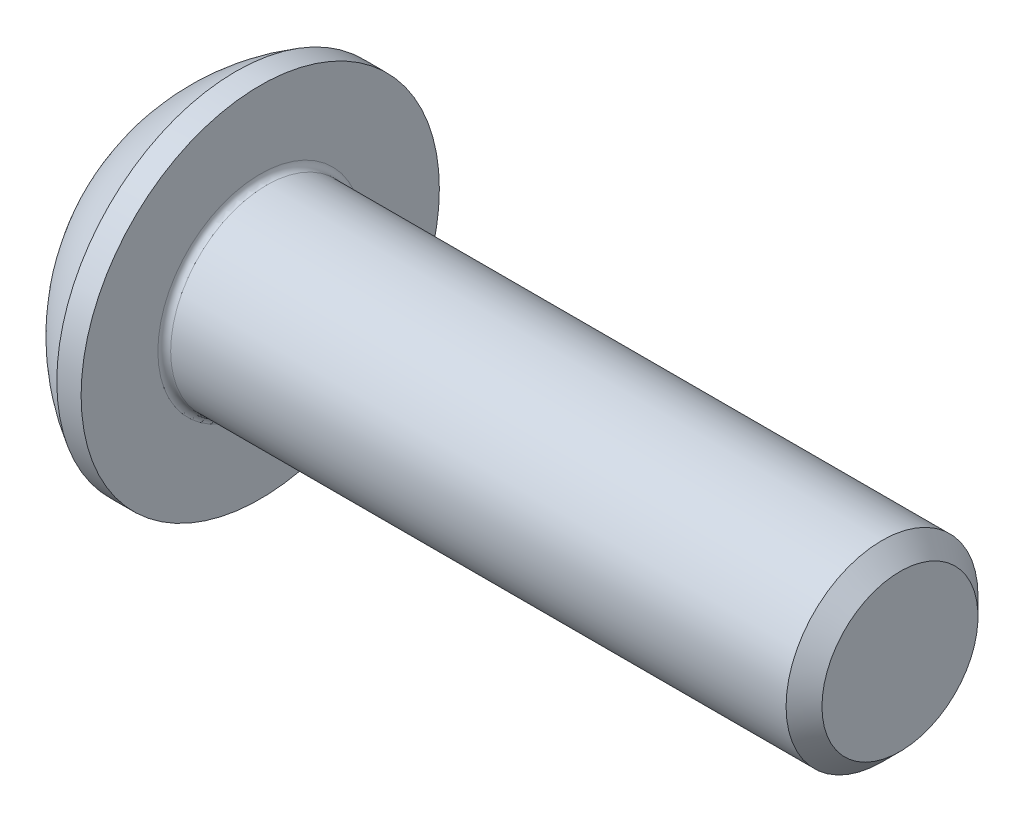
ISO-10303-21;
HEADER;
FILE_DESCRIPTION(('STEP AP214'),'2;1');
FILE_NAME('part.step','',(''),(''),'','','');
FILE_SCHEMA(('AUTOMOTIVE_DESIGN { 1 0 10303 214 1 1 1 1 }'));
ENDSEC;
DATA;
#1=APPLICATION_CONTEXT('core data for automotive mechanical design processes');
#2=APPLICATION_PROTOCOL_DEFINITION('international standard','automotive_design',2000,#1);
#3=PRODUCT_CONTEXT('',#1,'mechanical');
#4=PRODUCT('Part','Part','',(#3));
#5=PRODUCT_RELATED_PRODUCT_CATEGORY('part','',(#4));
#6=PRODUCT_DEFINITION_FORMATION('','',#4);
#7=PRODUCT_DEFINITION_CONTEXT('part definition',#1,'design');
#8=PRODUCT_DEFINITION('design','',#6,#7);
#9=PRODUCT_DEFINITION_SHAPE('','',#8);
#10=(LENGTH_UNIT() NAMED_UNIT(*) SI_UNIT(.MILLI.,.METRE.));
#11=(NAMED_UNIT(*) PLANE_ANGLE_UNIT() SI_UNIT($,.RADIAN.));
#12=(NAMED_UNIT(*) SI_UNIT($,.STERADIAN.) SOLID_ANGLE_UNIT());
#13=UNCERTAINTY_MEASURE_WITH_UNIT(LENGTH_MEASURE(1.E-05),#10,'distance_accuracy_value','');
#14=(GEOMETRIC_REPRESENTATION_CONTEXT(3) GLOBAL_UNCERTAINTY_ASSIGNED_CONTEXT((#13)) GLOBAL_UNIT_ASSIGNED_CONTEXT((#10,
#11,#12)) REPRESENTATION_CONTEXT('',''));
#15=CARTESIAN_POINT('',(0.,0.,0.));
#16=DIRECTION('',(0.,0.,1.));
#17=DIRECTION('',(1.,0.,0.));
#18=AXIS2_PLACEMENT_3D('',#15,#16,#17);
#19=CARTESIAN_POINT('',(0.,0.,0.));
#20=DIRECTION('',(-1.,0.,0.));
#21=DIRECTION('',(0.,0.,1.));
#22=AXIS2_PLACEMENT_3D('',#19,#20,#21);
#23=PLANE('',#22);
#24=CARTESIAN_POINT('',(0.,0.,0.));
#25=DIRECTION('',(-1.,0.,0.));
#26=DIRECTION('',(0.,0.,1.));
#27=AXIS2_PLACEMENT_3D('',#24,#25,#26);
#28=CIRCLE('',#27,1.4);
#29=CARTESIAN_POINT('',(0.,1.4,0.));
#30=VERTEX_POINT('',#29);
#31=EDGE_CURVE('E156',#30,#30,#28,.T.);
#32=ORIENTED_EDGE('',*,*,#31,.T.);
#33=EDGE_LOOP('',(#32));
#34=FACE_BOUND('',#33,.T.);
#35=DIRECTION('',(0.,-1.,0.));
#36=VECTOR('',#35,1.);
#37=CARTESIAN_POINT('',(0.,-0.577350269189625,0.999999999999998));
#38=LINE('',#37,#36);
#39=CARTESIAN_POINT('',(0.,0.577350269189628,1.));
#40=VERTEX_POINT('',#39);
#41=CARTESIAN_POINT('',(0.,-0.577350269189625,0.999999999999998));
#42=VERTEX_POINT('',#41);
#43=EDGE_CURVE('E51',#40,#42,#38,.T.);
#44=ORIENTED_EDGE('',*,*,#43,.T.);
#45=DIRECTION('',(0.,-0.499999999999999,-0.866025403784439));
#46=VECTOR('',#45,1.);
#47=CARTESIAN_POINT('',(0.,-1.15470053837925,0.));
#48=LINE('',#47,#46);
#49=CARTESIAN_POINT('',(0.,-1.15470053837925,0.));
#50=VERTEX_POINT('',#49);
#51=EDGE_CURVE('E276',#42,#50,#48,.T.);
#52=ORIENTED_EDGE('',*,*,#51,.T.);
#53=DIRECTION('',(0.,0.499999999999997,-0.86602540378444));
#54=VECTOR('',#53,1.);
#55=CARTESIAN_POINT('',(0.,-0.577350269189626,-1.));
#56=LINE('',#55,#54);
#57=CARTESIAN_POINT('',(0.,-0.577350269189626,-1.));
#58=VERTEX_POINT('',#57);
#59=EDGE_CURVE('E131',#50,#58,#56,.T.);
#60=ORIENTED_EDGE('',*,*,#59,.T.);
#61=DIRECTION('',(0.,1.,0.));
#62=VECTOR('',#61,1.);
#63=CARTESIAN_POINT('',(0.,0.577350269189628,-1.));
#64=LINE('',#63,#62);
#65=CARTESIAN_POINT('',(0.,0.577350269189628,-1.));
#66=VERTEX_POINT('',#65);
#67=EDGE_CURVE('E279',#58,#66,#64,.T.);
#68=ORIENTED_EDGE('',*,*,#67,.T.);
#69=DIRECTION('',(0.,0.499999999999998,0.866025403784439));
#70=VECTOR('',#69,1.);
#71=CARTESIAN_POINT('',(0.,1.15470053837925,0.));
#72=LINE('',#71,#70);
#73=CARTESIAN_POINT('',(0.,1.15470053837925,0.));
#74=VERTEX_POINT('',#73);
#75=EDGE_CURVE('E281',#66,#74,#72,.T.);
#76=ORIENTED_EDGE('',*,*,#75,.T.);
#77=DIRECTION('',(0.,-0.499999999999998,0.866025403784439));
#78=VECTOR('',#77,1.);
#79=CARTESIAN_POINT('',(0.,0.577350269189628,1.));
#80=LINE('',#79,#78);
#81=EDGE_CURVE('E283',#74,#40,#80,.T.);
#82=ORIENTED_EDGE('',*,*,#81,.T.);
#83=EDGE_LOOP('',(#44,#52,#60,#68,#76,#82));
#84=FACE_BOUND('',#83,.T.);
#85=ADVANCED_FACE('F36',(#34,#84),#23,.T.);
#86=CARTESIAN_POINT('',(2.88727272727273,0.,0.));
#87=DIRECTION('',(-1.,0.,0.));
#88=DIRECTION('',(0.,1.,0.));
#89=AXIS2_PLACEMENT_3D('',#86,#87,#88);
#90=SPHERICAL_SURFACE('',#89,3.2087916419819);
#91=CARTESIAN_POINT('',(1.32,0.,0.));
#92=DIRECTION('',(-1.,0.,0.));
#93=DIRECTION('',(0.,0.,1.));
#94=AXIS2_PLACEMENT_3D('',#91,#92,#93);
#95=CIRCLE('',#94,2.8);
#96=CARTESIAN_POINT('',(1.32,2.8,0.));
#97=VERTEX_POINT('',#96);
#98=EDGE_CURVE('E153',#97,#97,#95,.T.);
#99=CARTESIAN_POINT('',(1.32,2.8,0.));
#100=CARTESIAN_POINT('',(1.30223685243605,2.79005728003977,0.));
#101=CARTESIAN_POINT('',(1.28456834454886,2.77994548393524,0.));
#102=CARTESIAN_POINT('',(1.24942695184036,2.75938749748818,0.));
#103=CARTESIAN_POINT('',(1.23195406701906,2.74894130714565,0.));
#104=CARTESIAN_POINT('',(1.19721026415473,2.72771829027321,0.));
#105=CARTESIAN_POINT('',(1.1799393461117,2.71694146374331,0.));
#106=CARTESIAN_POINT('',(1.1456057283776,2.69506108475795,0.));
#107=CARTESIAN_POINT('',(1.12854302868653,2.68395753230251,0.));
#108=CARTESIAN_POINT('',(1.09463202889982,2.66142772137324,0.));
#109=CARTESIAN_POINT('',(1.07778372880418,2.65000146289942,0.));
#110=CARTESIAN_POINT('',(1.04430763043242,2.62683037905586,0.));
#111=CARTESIAN_POINT('',(1.0276798321563,2.61508555368612,0.));
#112=CARTESIAN_POINT('',(0.994650760146405,2.59128158993487,0.));
#113=CARTESIAN_POINT('',(0.978249486412629,2.57922245155336,0.));
#114=CARTESIAN_POINT('',(0.945679404064408,2.55479422967524,0.));
#115=CARTESIAN_POINT('',(0.929510595449963,2.54242514617864,0.));
#116=CARTESIAN_POINT('',(0.897411299743948,2.51738151418539,0.));
#117=CARTESIAN_POINT('',(0.881480812652378,2.50470696568875,0.));
#118=CARTESIAN_POINT('',(0.849863930067758,2.47905699446294,0.));
#119=CARTESIAN_POINT('',(0.834177534574709,2.46608157173378,0.));
#120=CARTESIAN_POINT('',(0.803054516853843,2.43983455178493,0.));
#121=CARTESIAN_POINT('',(0.787617894626026,2.42656295456524,0.));
#122=CARTESIAN_POINT('',(0.7570000146331,2.39972839265361,0.));
#123=CARTESIAN_POINT('',(0.741818756867991,2.38616542796167,0.));
#124=CARTESIAN_POINT('',(0.711717104504202,2.35875304365786,0.));
#125=CARTESIAN_POINT('',(0.696796709905523,2.344903624046,0.));
#126=CARTESIAN_POINT('',(0.667222188092748,2.31692334620972,0.));
#127=CARTESIAN_POINT('',(0.652568060878652,2.30279248798529,0.));
#128=CARTESIAN_POINT('',(0.623531381610245,2.27425445116925,0.));
#129=CARTESIAN_POINT('',(0.609148829555934,2.25984727257764,0.));
#130=CARTESIAN_POINT('',(0.580660510016839,2.23076181335678,0.));
#131=CARTESIAN_POINT('',(0.566554742532055,2.21608353272753,0.));
#132=CARTESIAN_POINT('',(0.538625101289437,2.18646118595506,0.));
#133=CARTESIAN_POINT('',(0.524801227531604,2.17151711981183,0.));
#134=CARTESIAN_POINT('',(0.497440380797433,2.14136861480347,0.));
#135=CARTESIAN_POINT('',(0.483903407821096,2.12616417593834,0.));
#136=CARTESIAN_POINT('',(0.457121265788016,2.09550043258613,0.));
#137=CARTESIAN_POINT('',(0.443876096731274,2.08004112809906,0.));
#138=CARTESIAN_POINT('',(0.417682359983098,2.04887325291616,0.));
#139=CARTESIAN_POINT('',(0.404733792291664,2.03316468222032,0.));
#140=CARTESIAN_POINT('',(0.3791379482898,2.00150396431813,0.));
#141=CARTESIAN_POINT('',(0.366490671979371,1.98555181711178,0.));
#142=CARTESIAN_POINT('',(0.341501991626376,1.95340972411107,0.));
#143=CARTESIAN_POINT('',(0.329160587583812,1.93721977831671,0.));
#144=CARTESIAN_POINT('',(0.30478812186566,1.90460795219388,0.));
#145=CARTESIAN_POINT('',(0.292757060190073,1.88818607186539,0.));
#146=CARTESIAN_POINT('',(0.269009636897027,1.8551163247361,0.));
#147=CARTESIAN_POINT('',(0.257293275279569,1.83846845793529,0.));
#148=CARTESIAN_POINT('',(0.234179495811814,1.80495276777454,0.));
#149=CARTESIAN_POINT('',(0.222782077961518,1.7880849444146,0.));
#150=CARTESIAN_POINT('',(0.200310314202188,1.7541354507241,0.));
#151=CARTESIAN_POINT('',(0.189235968293156,1.73705378039354,0.));
#152=CARTESIAN_POINT('',(0.16741435961898,1.7026827797829,0.));
#153=CARTESIAN_POINT('',(0.156667096853836,1.68539344950282,0.));
#154=CARTESIAN_POINT('',(0.13550354702667,1.65061339131721,0.));
#155=CARTESIAN_POINT('',(0.125087259964647,1.63312266341169,0.));
#156=CARTESIAN_POINT('',(0.104589434867148,1.59794614491831,0.));
#157=CARTESIAN_POINT('',(0.094507896831671,1.58026035433045,0.));
#158=CARTESIAN_POINT('',(0.0746832194572848,1.54470011729165,0.));
#159=CARTESIAN_POINT('',(0.0649400801183755,1.52682567084071,0.));
#160=CARTESIAN_POINT('',(0.0457957362178669,1.49089459265953,0.));
#161=CARTESIAN_POINT('',(0.0363945316562677,1.47283796092929,0.));
#162=CARTESIAN_POINT('',(0.0179374360277654,1.4365490658068,0.));
#163=CARTESIAN_POINT('',(0.00888154496086232,1.41831680241457,0.));
#164=CARTESIAN_POINT('',(0.,1.4,0.));
#165=B_SPLINE_CURVE_WITH_KNOTS('',3,(#99,#100,#101,#102,#103,#104,#105,#106,#107,#108,#109,#110,
#111,#112,#113,#114,#115,#116,#117,#118,#119,#120,#121,#122,#123,#124,#125,#126,#127,#128,#129,
#130,#131,#132,#133,#134,#135,#136,#137,#138,#139,#140,#141,#142,#143,#144,#145,#146,#147,#148,
#149,#150,#151,#152,#153,#154,#155,#156,#157,#158,#159,#160,#161,#162,#163,#164),.UNSPECIFIED.,
.F.,.F.,(4,2,2,2,2,2,2,2,2,2,2,2,2,2,2,2,2,2,2,2,2,2,2,2,2,2,2,2,2,2,2,2,4),(0.,
0.0610685768840659,0.122137153768132,0.183205730652197,0.244274307536263,0.305342884420328,
0.366411461304395,0.427480038188461,0.488548615072526,0.549617191956591,0.610685768840658,
0.671754345724723,0.732822922608789,0.793891499492855,0.854960076376921,0.916028653260986,
0.977097230145052,1.03816580702912,1.09923438391318,1.16030296079725,1.22137153768132,
1.28244011456538,1.34350869144945,1.40457726833351,1.46564584521758,1.52671442210164,
1.58778299898571,1.64885157586978,1.70992015275384,1.77098872963791,1.83205730652197,
1.89312588340604,1.9541944602901),.UNSPECIFIED.);
#166=EDGE_CURVE('BSEAM177',#97,#30,#165,.T.);
#167=ORIENTED_EDGE('',*,*,#98,.T.);
#168=ORIENTED_EDGE('',*,*,#31,.F.);
#169=ORIENTED_EDGE('',*,*,#166,.T.);
#170=ORIENTED_EDGE('',*,*,#166,.F.);
#171=EDGE_LOOP('',(#167,#169,#168,#170));
#172=FACE_BOUND('',#171,.T.);
#173=ADVANCED_FACE('F177',(#172),#90,.T.);
#174=CARTESIAN_POINT('',(0.,0.,0.));
#175=DIRECTION('',(-1.,0.,0.));
#176=DIRECTION('',(0.,0.,1.));
#177=AXIS2_PLACEMENT_3D('',#174,#175,#176);
#178=CYLINDRICAL_SURFACE('',#177,2.8);
#179=ORIENTED_EDGE('',*,*,#98,.F.);
#180=EDGE_LOOP('',(#179));
#181=FACE_BOUND('',#180,.T.);
#182=CARTESIAN_POINT('',(1.7,0.,0.));
#183=DIRECTION('',(-1.,0.,0.));
#184=DIRECTION('',(0.,0.,1.));
#185=AXIS2_PLACEMENT_3D('',#182,#183,#184);
#186=CIRCLE('',#185,2.8);
#187=CARTESIAN_POINT('',(1.7,0.,2.8));
#188=VERTEX_POINT('',#187);
#189=EDGE_CURVE('E150',#188,#188,#186,.T.);
#190=ORIENTED_EDGE('',*,*,#189,.T.);
#191=EDGE_LOOP('',(#190));
#192=FACE_BOUND('',#191,.T.);
#193=ADVANCED_FACE('F182',(#181,#192),#178,.T.);
#194=CARTESIAN_POINT('',(1.7,1.5,0.));
#195=DIRECTION('',(-1.,0.,0.));
#196=DIRECTION('',(0.,0.,1.));
#197=AXIS2_PLACEMENT_3D('',#194,#195,#196);
#198=PLANE('',#197);
#199=CARTESIAN_POINT('',(1.7,0.,0.));
#200=DIRECTION('',(-1.,0.,0.));
#201=DIRECTION('',(0.,0.,1.));
#202=AXIS2_PLACEMENT_3D('',#199,#200,#201);
#203=CIRCLE('',#202,1.6);
#204=CARTESIAN_POINT('',(1.7,0.,1.6));
#205=VERTEX_POINT('',#204);
#206=EDGE_CURVE('E44',#205,#205,#203,.T.);
#207=ORIENTED_EDGE('',*,*,#206,.T.);
#208=EDGE_LOOP('',(#207));
#209=FACE_BOUND('',#208,.T.);
#210=ORIENTED_EDGE('',*,*,#189,.F.);
#211=EDGE_LOOP('',(#210));
#212=FACE_BOUND('',#211,.T.);
#213=ADVANCED_FACE('F161',(#209,#212),#198,.F.);
#214=CARTESIAN_POINT('',(0.,0.,0.));
#215=DIRECTION('',(-1.,0.,0.));
#216=DIRECTION('',(0.,0.,1.));
#217=AXIS2_PLACEMENT_3D('',#214,#215,#216);
#218=CYLINDRICAL_SURFACE('',#217,1.5);
#219=CARTESIAN_POINT('',(1.8,0.,0.));
#220=DIRECTION('',(-1.,0.,0.));
#221=DIRECTION('',(0.,0.,1.));
#222=AXIS2_PLACEMENT_3D('',#219,#220,#221);
#223=CIRCLE('',#222,1.5);
#224=CARTESIAN_POINT('',(1.8,0.,1.5));
#225=VERTEX_POINT('',#224);
#226=EDGE_CURVE('E11',#225,#225,#223,.F.);
#227=ORIENTED_EDGE('',*,*,#226,.T.);
#228=EDGE_LOOP('',(#227));
#229=FACE_BOUND('',#228,.T.);
#230=CARTESIAN_POINT('',(11.4195,0.,0.));
#231=DIRECTION('',(-1.,0.,0.));
#232=DIRECTION('',(0.,0.,1.));
#233=AXIS2_PLACEMENT_3D('',#230,#231,#232);
#234=CIRCLE('',#233,1.5);
#235=CARTESIAN_POINT('',(11.4195,0.,1.5));
#236=VERTEX_POINT('',#235);
#237=EDGE_CURVE('E147',#236,#236,#234,.T.);
#238=ORIENTED_EDGE('',*,*,#237,.T.);
#239=EDGE_LOOP('',(#238));
#240=FACE_BOUND('',#239,.T.);
#241=ADVANCED_FACE('F191',(#229,#240),#218,.T.);
#242=CARTESIAN_POINT('',(11.7,0.,0.));
#243=DIRECTION('',(-1.,0.,0.));
#244=DIRECTION('',(0.,0.,1.));
#245=AXIS2_PLACEMENT_3D('',#242,#243,#244);
#246=CONICAL_SURFACE('',#245,1.2195,0.785398163397449);
#247=ORIENTED_EDGE('',*,*,#237,.F.);
#248=EDGE_LOOP('',(#247));
#249=FACE_BOUND('',#248,.T.);
#250=CARTESIAN_POINT('',(11.7,0.,0.));
#251=DIRECTION('',(-1.,0.,0.));
#252=DIRECTION('',(0.,0.,1.));
#253=AXIS2_PLACEMENT_3D('',#250,#251,#252);
#254=CIRCLE('',#253,1.2195);
#255=CARTESIAN_POINT('',(11.7,0.,1.2195));
#256=VERTEX_POINT('',#255);
#257=EDGE_CURVE('E143',#256,#256,#254,.T.);
#258=ORIENTED_EDGE('',*,*,#257,.T.);
#259=EDGE_LOOP('',(#258));
#260=FACE_BOUND('',#259,.T.);
#261=ADVANCED_FACE('F172',(#249,#260),#246,.T.);
#262=CARTESIAN_POINT('',(11.7,0.,0.));
#263=DIRECTION('',(-1.,0.,0.));
#264=DIRECTION('',(0.,0.,1.));
#265=AXIS2_PLACEMENT_3D('',#262,#263,#264);
#266=PLANE('',#265);
#267=ORIENTED_EDGE('',*,*,#257,.F.);
#268=EDGE_LOOP('',(#267));
#269=FACE_BOUND('',#268,.T.);
#270=ADVANCED_FACE('F165',(#269),#266,.F.);
#271=CARTESIAN_POINT('',(1.8,0.,0.));
#272=DIRECTION('',(-1.,0.,0.));
#273=DIRECTION('',(0.,0.,1.));
#274=AXIS2_PLACEMENT_3D('',#271,#272,#273);
#275=TOROIDAL_SURFACE('',#274,1.6,0.1);
#276=ORIENTED_EDGE('',*,*,#226,.F.);
#277=EDGE_LOOP('',(#276));
#278=FACE_BOUND('',#277,.T.);
#279=ORIENTED_EDGE('',*,*,#206,.F.);
#280=EDGE_LOOP('',(#279));
#281=FACE_BOUND('',#280,.T.);
#282=ADVANCED_FACE('F38',(#278,#281),#275,.F.);
#283=CARTESIAN_POINT('',(1.04,-1.15470053837925,0.));
#284=DIRECTION('',(0.,0.866025403784439,-0.499999999999999));
#285=DIRECTION('',(0.,0.499999999999999,0.866025403784439));
#286=AXIS2_PLACEMENT_3D('',#283,#284,#285);
#287=PLANE('',#286);
#288=DIRECTION('',(0.,-0.499999999999999,-0.866025403784439));
#289=VECTOR('',#288,1.);
#290=CARTESIAN_POINT('',(1.04,-1.15470053837925,0.));
#291=LINE('',#290,#289);
#292=CARTESIAN_POINT('',(1.04,-0.577350269189625,0.999999999999998));
#293=VERTEX_POINT('',#292);
#294=CARTESIAN_POINT('',(1.04,-0.866025403784437,0.499999999999998));
#295=VERTEX_POINT('',#294);
#296=EDGE_CURVE('E117',#293,#295,#291,.T.);
#297=ORIENTED_EDGE('',*,*,#296,.T.);
#298=CARTESIAN_POINT('',(1.04,-1.15470053837925,0.));
#299=VERTEX_POINT('',#298);
#300=EDGE_CURVE('E112',#295,#299,#291,.T.);
#301=ORIENTED_EDGE('',*,*,#300,.T.);
#302=DIRECTION('',(-1.,0.,0.));
#303=VECTOR('',#302,1.);
#304=CARTESIAN_POINT('',(1.04,-1.15470053837925,0.));
#305=LINE('',#304,#303);
#306=EDGE_CURVE('E114',#299,#50,#305,.T.);
#307=ORIENTED_EDGE('',*,*,#306,.T.);
#308=ORIENTED_EDGE('',*,*,#51,.F.);
#309=DIRECTION('',(-1.,0.,0.));
#310=VECTOR('',#309,1.);
#311=CARTESIAN_POINT('',(1.04,-0.577350269189625,0.999999999999998));
#312=LINE('',#311,#310);
#313=EDGE_CURVE('E272',#293,#42,#312,.T.);
#314=ORIENTED_EDGE('',*,*,#313,.F.);
#315=EDGE_LOOP('',(#297,#301,#307,#308,#314));
#316=FACE_BOUND('',#315,.T.);
#317=ADVANCED_FACE('F113',(#316),#287,.T.);
#318=CARTESIAN_POINT('',(1.04,-0.577350269189626,-1.));
#319=DIRECTION('',(0.,0.86602540378444,0.499999999999998));
#320=DIRECTION('',(0.,-0.499999999999998,0.86602540378444));
#321=AXIS2_PLACEMENT_3D('',#318,#319,#320);
#322=PLANE('',#321);
#323=DIRECTION('',(0.,0.499999999999997,-0.86602540378444));
#324=VECTOR('',#323,1.);
#325=CARTESIAN_POINT('',(1.04,-0.577350269189626,-1.));
#326=LINE('',#325,#324);
#327=CARTESIAN_POINT('',(1.04,-0.86602540378444,-0.499999999999997));
#328=VERTEX_POINT('',#327);
#329=EDGE_CURVE('E59',#299,#328,#326,.T.);
#330=ORIENTED_EDGE('',*,*,#329,.T.);
#331=CARTESIAN_POINT('',(1.04,-0.577350269189626,-1.));
#332=VERTEX_POINT('',#331);
#333=EDGE_CURVE('E126',#328,#332,#326,.T.);
#334=ORIENTED_EDGE('',*,*,#333,.T.);
#335=DIRECTION('',(-1.,0.,0.));
#336=VECTOR('',#335,1.);
#337=CARTESIAN_POINT('',(1.04,-0.577350269189626,-1.));
#338=LINE('',#337,#336);
#339=EDGE_CURVE('E133',#332,#58,#338,.T.);
#340=ORIENTED_EDGE('',*,*,#339,.T.);
#341=ORIENTED_EDGE('',*,*,#59,.F.);
#342=ORIENTED_EDGE('',*,*,#306,.F.);
#343=EDGE_LOOP('',(#330,#334,#340,#341,#342));
#344=FACE_BOUND('',#343,.T.);
#345=ADVANCED_FACE('F129',(#344),#322,.T.);
#346=CARTESIAN_POINT('',(1.04,0.577350269189628,-1.));
#347=DIRECTION('',(0.,0.,1.));
#348=DIRECTION('',(0.,-1.,0.));
#349=AXIS2_PLACEMENT_3D('',#346,#347,#348);
#350=PLANE('',#349);
#351=DIRECTION('',(0.,1.,0.));
#352=VECTOR('',#351,1.);
#353=CARTESIAN_POINT('',(1.04,0.577350269189628,-1.));
#354=LINE('',#353,#352);
#355=CARTESIAN_POINT('',(1.04,0.,-1.));
#356=VERTEX_POINT('',#355);
#357=EDGE_CURVE('E253',#332,#356,#354,.T.);
#358=ORIENTED_EDGE('',*,*,#357,.T.);
#359=CARTESIAN_POINT('',(1.04,0.577350269189628,-1.));
#360=VERTEX_POINT('',#359);
#361=EDGE_CURVE('E125',#356,#360,#354,.T.);
#362=ORIENTED_EDGE('',*,*,#361,.T.);
#363=DIRECTION('',(-1.,0.,0.));
#364=VECTOR('',#363,1.);
#365=CARTESIAN_POINT('',(1.04,0.577350269189628,-1.));
#366=LINE('',#365,#364);
#367=EDGE_CURVE('E138',#360,#66,#366,.T.);
#368=ORIENTED_EDGE('',*,*,#367,.T.);
#369=ORIENTED_EDGE('',*,*,#67,.F.);
#370=ORIENTED_EDGE('',*,*,#339,.F.);
#371=EDGE_LOOP('',(#358,#362,#368,#369,#370));
#372=FACE_BOUND('',#371,.T.);
#373=ADVANCED_FACE('F205',(#372),#350,.T.);
#374=CARTESIAN_POINT('',(1.04,1.15470053837925,0.));
#375=DIRECTION('',(0.,-0.86602540378444,0.499999999999998));
#376=DIRECTION('',(0.,-0.499999999999998,-0.86602540378444));
#377=AXIS2_PLACEMENT_3D('',#374,#375,#376);
#378=PLANE('',#377);
#379=DIRECTION('',(0.,0.499999999999998,0.866025403784439));
#380=VECTOR('',#379,1.);
#381=CARTESIAN_POINT('',(1.04,1.15470053837925,0.));
#382=LINE('',#381,#380);
#383=CARTESIAN_POINT('',(1.04,0.86602540378444,-0.499999999999999));
#384=VERTEX_POINT('',#383);
#385=EDGE_CURVE('E242',#360,#384,#382,.T.);
#386=ORIENTED_EDGE('',*,*,#385,.T.);
#387=CARTESIAN_POINT('',(1.04,1.15470053837925,0.));
#388=VERTEX_POINT('',#387);
#389=EDGE_CURVE('E247',#384,#388,#382,.T.);
#390=ORIENTED_EDGE('',*,*,#389,.T.);
#391=DIRECTION('',(-1.,0.,0.));
#392=VECTOR('',#391,1.);
#393=CARTESIAN_POINT('',(1.04,1.15470053837925,0.));
#394=LINE('',#393,#392);
#395=EDGE_CURVE('E287',#388,#74,#394,.T.);
#396=ORIENTED_EDGE('',*,*,#395,.T.);
#397=ORIENTED_EDGE('',*,*,#75,.F.);
#398=ORIENTED_EDGE('',*,*,#367,.F.);
#399=EDGE_LOOP('',(#386,#390,#396,#397,#398));
#400=FACE_BOUND('',#399,.T.);
#401=ADVANCED_FACE('F208',(#400),#378,.T.);
#402=CARTESIAN_POINT('',(1.04,0.577350269189628,1.));
#403=DIRECTION('',(0.,-0.86602540378444,-0.499999999999998));
#404=DIRECTION('',(0.,0.499999999999998,-0.86602540378444));
#405=AXIS2_PLACEMENT_3D('',#402,#403,#404);
#406=PLANE('',#405);
#407=DIRECTION('',(0.,-0.499999999999998,0.866025403784439));
#408=VECTOR('',#407,1.);
#409=CARTESIAN_POINT('',(1.04,0.577350269189628,1.));
#410=LINE('',#409,#408);
#411=CARTESIAN_POINT('',(1.04,0.86602540378444,0.499999999999999));
#412=VERTEX_POINT('',#411);
#413=EDGE_CURVE('E250',#388,#412,#410,.T.);
#414=ORIENTED_EDGE('',*,*,#413,.T.);
#415=CARTESIAN_POINT('',(1.04,0.577350269189628,1.));
#416=VERTEX_POINT('',#415);
#417=EDGE_CURVE('E258',#412,#416,#410,.T.);
#418=ORIENTED_EDGE('',*,*,#417,.T.);
#419=DIRECTION('',(-1.,0.,0.));
#420=VECTOR('',#419,1.);
#421=CARTESIAN_POINT('',(1.04,0.577350269189628,1.));
#422=LINE('',#421,#420);
#423=EDGE_CURVE('E271',#416,#40,#422,.T.);
#424=ORIENTED_EDGE('',*,*,#423,.T.);
#425=ORIENTED_EDGE('',*,*,#81,.F.);
#426=ORIENTED_EDGE('',*,*,#395,.F.);
#427=EDGE_LOOP('',(#414,#418,#424,#425,#426));
#428=FACE_BOUND('',#427,.T.);
#429=ADVANCED_FACE('F212',(#428),#406,.T.);
#430=CARTESIAN_POINT('',(1.04,-0.577350269189625,0.999999999999998));
#431=DIRECTION('',(0.,0.,-1.));
#432=DIRECTION('',(0.,1.,0.));
#433=AXIS2_PLACEMENT_3D('',#430,#431,#432);
#434=PLANE('',#433);
#435=DIRECTION('',(0.,-1.,0.));
#436=VECTOR('',#435,1.);
#437=CARTESIAN_POINT('',(1.04,-0.577350269189625,0.999999999999998));
#438=LINE('',#437,#436);
#439=CARTESIAN_POINT('',(1.04,0.,1.));
#440=VERTEX_POINT('',#439);
#441=EDGE_CURVE('E264',#416,#440,#438,.T.);
#442=ORIENTED_EDGE('',*,*,#441,.T.);
#443=EDGE_CURVE('E266',#440,#293,#438,.T.);
#444=ORIENTED_EDGE('',*,*,#443,.T.);
#445=ORIENTED_EDGE('',*,*,#313,.T.);
#446=ORIENTED_EDGE('',*,*,#43,.F.);
#447=ORIENTED_EDGE('',*,*,#423,.F.);
#448=EDGE_LOOP('',(#442,#444,#445,#446,#447));
#449=FACE_BOUND('',#448,.T.);
#450=ADVANCED_FACE('F216',(#449),#434,.T.);
#451=CARTESIAN_POINT('',(1.04,-1.73205080756887,-0.999999999999999));
#452=DIRECTION('',(1.,0.,0.));
#453=DIRECTION('',(0.,0.,-1.));
#454=AXIS2_PLACEMENT_3D('',#451,#452,#453);
#455=PLANE('',#454);
#456=CARTESIAN_POINT('',(1.04,0.,0.));
#457=DIRECTION('',(-1.,0.,0.));
#458=DIRECTION('',(0.,0.,1.));
#459=AXIS2_PLACEMENT_3D('',#456,#457,#458);
#460=CIRCLE('',#459,1.);
#461=EDGE_CURVE('E239',#384,#356,#460,.T.);
#462=ORIENTED_EDGE('',*,*,#461,.F.);
#463=ORIENTED_EDGE('',*,*,#385,.F.);
#464=ORIENTED_EDGE('',*,*,#361,.F.);
#465=EDGE_LOOP('',(#462,#463,#464));
#466=FACE_BOUND('',#465,.T.);
#467=ADVANCED_FACE('F220',(#466),#455,.F.);
#468=EDGE_CURVE('E144',#412,#384,#460,.T.);
#469=ORIENTED_EDGE('',*,*,#468,.F.);
#470=ORIENTED_EDGE('',*,*,#413,.F.);
#471=ORIENTED_EDGE('',*,*,#389,.F.);
#472=EDGE_LOOP('',(#469,#470,#471));
#473=FACE_BOUND('',#472,.T.);
#474=ADVANCED_FACE('F229',(#473),#455,.F.);
#475=EDGE_CURVE('E137',#440,#412,#460,.T.);
#476=ORIENTED_EDGE('',*,*,#475,.F.);
#477=ORIENTED_EDGE('',*,*,#441,.F.);
#478=ORIENTED_EDGE('',*,*,#417,.F.);
#479=EDGE_LOOP('',(#476,#477,#478));
#480=FACE_BOUND('',#479,.T.);
#481=ADVANCED_FACE('F234',(#480),#455,.F.);
#482=EDGE_CURVE('E132',#295,#440,#460,.T.);
#483=ORIENTED_EDGE('',*,*,#482,.F.);
#484=ORIENTED_EDGE('',*,*,#296,.F.);
#485=ORIENTED_EDGE('',*,*,#443,.F.);
#486=EDGE_LOOP('',(#483,#484,#485));
#487=FACE_BOUND('',#486,.T.);
#488=ADVANCED_FACE('F227',(#487),#455,.F.);
#489=EDGE_CURVE('E123',#328,#295,#460,.T.);
#490=ORIENTED_EDGE('',*,*,#489,.F.);
#491=ORIENTED_EDGE('',*,*,#329,.F.);
#492=ORIENTED_EDGE('',*,*,#300,.F.);
#493=EDGE_LOOP('',(#490,#491,#492));
#494=FACE_BOUND('',#493,.T.);
#495=ADVANCED_FACE('F122',(#494),#455,.F.);
#496=EDGE_CURVE('E245',#356,#328,#460,.T.);
#497=ORIENTED_EDGE('',*,*,#496,.F.);
#498=ORIENTED_EDGE('',*,*,#357,.F.);
#499=ORIENTED_EDGE('',*,*,#333,.F.);
#500=EDGE_LOOP('',(#497,#498,#499));
#501=FACE_BOUND('',#500,.T.);
#502=ADVANCED_FACE('F200',(#501),#455,.F.);
#503=CARTESIAN_POINT('',(1.61735026918963,0.,0.));
#504=DIRECTION('',(-1.,0.,0.));
#505=DIRECTION('',(0.,0.,1.));
#506=AXIS2_PLACEMENT_3D('',#503,#504,#505);
#507=CONICAL_SURFACE('',#506,0.,1.04719755119659);
#508=ORIENTED_EDGE('',*,*,#475,.T.);
#509=ORIENTED_EDGE('',*,*,#468,.T.);
#510=ORIENTED_EDGE('',*,*,#461,.T.);
#511=ORIENTED_EDGE('',*,*,#496,.T.);
#512=ORIENTED_EDGE('',*,*,#489,.T.);
#513=ORIENTED_EDGE('',*,*,#482,.T.);
#514=EDGE_LOOP('',(#508,#509,#510,#511,#512,#513));
#515=FACE_BOUND('',#514,.T.);
#516=CARTESIAN_POINT('',(1.61735026918963,0.,0.));
#517=VERTEX_POINT('',#516);
#518=VERTEX_LOOP('',#517);
#519=FACE_BOUND('',#518,.T.);
#520=ADVANCED_FACE('F198',(#515,#519),#507,.F.);
#521=CLOSED_SHELL('',(#85,#173,#193,#213,#241,#261,#270,#282,#317,#345,#373,#401,#429,#450,#467,
#474,#481,#488,#495,#502,#520));
#522=MANIFOLD_SOLID_BREP('B2',#521);
#523=ADVANCED_BREP_SHAPE_REPRESENTATION('',(#18,#522),#14);
#524=SHAPE_DEFINITION_REPRESENTATION(#9,#523);
ENDSEC;
END-ISO-10303-21;
